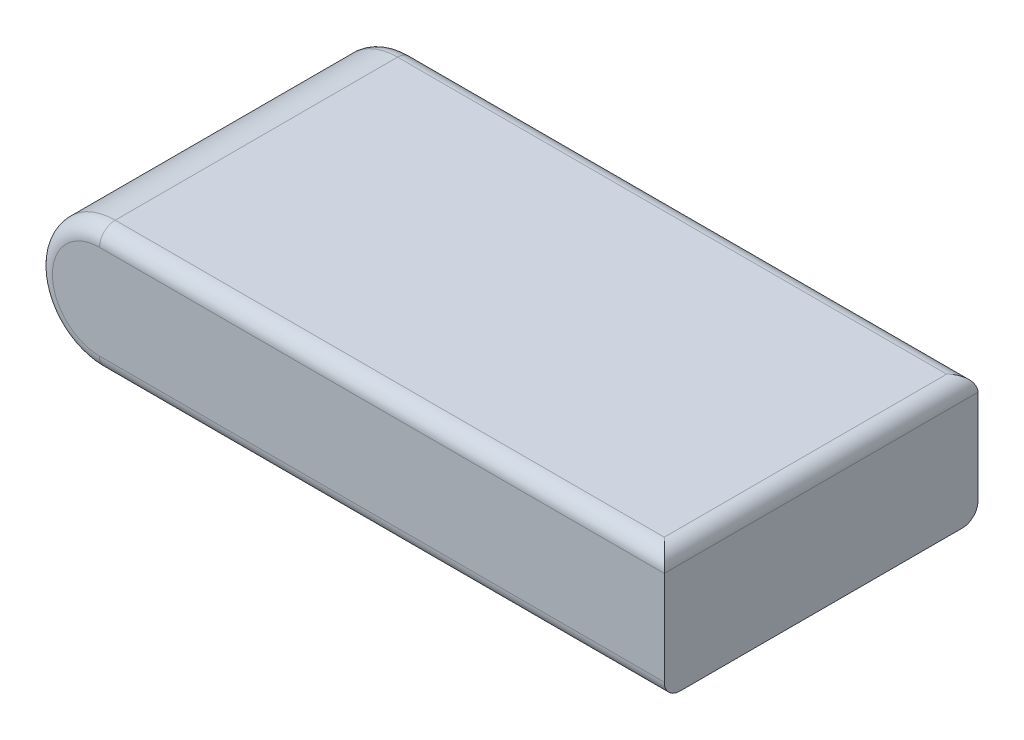
ISO-10303-21;
HEADER;
FILE_DESCRIPTION(('STEP AP214'),'2;1');
FILE_NAME('part.step','',(''),(''),'','','');
FILE_SCHEMA(('AUTOMOTIVE_DESIGN { 1 0 10303 214 1 1 1 1 }'));
ENDSEC;
DATA;
#1=APPLICATION_CONTEXT('core data for automotive mechanical design processes');
#2=APPLICATION_PROTOCOL_DEFINITION('international standard','automotive_design',2000,#1);
#3=PRODUCT_CONTEXT('',#1,'mechanical');
#4=PRODUCT('Part','Part','',(#3));
#5=PRODUCT_RELATED_PRODUCT_CATEGORY('part','',(#4));
#6=PRODUCT_DEFINITION_FORMATION('','',#4);
#7=PRODUCT_DEFINITION_CONTEXT('part definition',#1,'design');
#8=PRODUCT_DEFINITION('design','',#6,#7);
#9=PRODUCT_DEFINITION_SHAPE('','',#8);
#10=(LENGTH_UNIT() NAMED_UNIT(*) SI_UNIT(.MILLI.,.METRE.));
#11=(NAMED_UNIT(*) PLANE_ANGLE_UNIT() SI_UNIT($,.RADIAN.));
#12=(NAMED_UNIT(*) SI_UNIT($,.STERADIAN.) SOLID_ANGLE_UNIT());
#13=UNCERTAINTY_MEASURE_WITH_UNIT(LENGTH_MEASURE(1.E-05),#10,'distance_accuracy_value','');
#14=(GEOMETRIC_REPRESENTATION_CONTEXT(3) GLOBAL_UNCERTAINTY_ASSIGNED_CONTEXT((#13)) GLOBAL_UNIT_ASSIGNED_CONTEXT((#10,
#11,#12)) REPRESENTATION_CONTEXT('',''));
#15=CARTESIAN_POINT('',(0.,0.,0.));
#16=DIRECTION('',(0.,0.,1.));
#17=DIRECTION('',(1.,0.,0.));
#18=AXIS2_PLACEMENT_3D('',#15,#16,#17);
#19=CARTESIAN_POINT('',(-18.,0.,20.));
#20=DIRECTION('',(0.,0.,-1.));
#21=DIRECTION('',(-1.,0.,0.));
#22=AXIS2_PLACEMENT_3D('',#19,#20,#21);
#23=CYLINDRICAL_SURFACE('',#22,4.);
#24=DIRECTION('',(0.,0.,-1.));
#25=VECTOR('',#24,1.);
#26=CARTESIAN_POINT('',(-18.,-4.00000000000001,20.));
#27=LINE('',#26,#25);
#28=CARTESIAN_POINT('',(-18.,-4.00000000000001,19.));
#29=VERTEX_POINT('',#28);
#30=CARTESIAN_POINT('',(-18.,-4.00000000000001,1.));
#31=VERTEX_POINT('',#30);
#32=EDGE_CURVE('E133',#29,#31,#27,.T.);
#33=ORIENTED_EDGE('',*,*,#32,.F.);
#34=CARTESIAN_POINT('',(-18.,0.,19.));
#35=DIRECTION('',(0.,0.,-1.));
#36=DIRECTION('',(-1.,0.,0.));
#37=AXIS2_PLACEMENT_3D('',#34,#35,#36);
#38=CIRCLE('',#37,4.);
#39=CARTESIAN_POINT('',(-18.,4.,19.));
#40=VERTEX_POINT('',#39);
#41=EDGE_CURVE('E145',#29,#40,#38,.T.);
#42=ORIENTED_EDGE('',*,*,#41,.T.);
#43=DIRECTION('',(0.,0.,-1.));
#44=VECTOR('',#43,1.);
#45=CARTESIAN_POINT('',(-18.,4.,20.));
#46=LINE('',#45,#44);
#47=CARTESIAN_POINT('',(-18.,4.,1.));
#48=VERTEX_POINT('',#47);
#49=EDGE_CURVE('E124',#40,#48,#46,.T.);
#50=ORIENTED_EDGE('',*,*,#49,.T.);
#51=CARTESIAN_POINT('',(-18.,0.,1.));
#52=DIRECTION('',(0.,0.,-1.));
#53=DIRECTION('',(-1.,0.,0.));
#54=AXIS2_PLACEMENT_3D('',#51,#52,#53);
#55=CIRCLE('',#54,4.);
#56=EDGE_CURVE('E143',#48,#31,#55,.F.);
#57=ORIENTED_EDGE('',*,*,#56,.T.);
#58=EDGE_LOOP('',(#33,#42,#50,#57));
#59=FACE_BOUND('',#58,.T.);
#60=ADVANCED_FACE('F35',(#59),#23,.T.);
#61=CARTESIAN_POINT('',(18.,-4.,20.));
#62=DIRECTION('',(0.,1.,0.));
#63=DIRECTION('',(-1.,0.,0.));
#64=AXIS2_PLACEMENT_3D('',#61,#62,#63);
#65=PLANE('',#64);
#66=DIRECTION('',(0.,0.,-1.));
#67=VECTOR('',#66,1.);
#68=CARTESIAN_POINT('',(18.,-4.,20.));
#69=LINE('',#68,#67);
#70=CARTESIAN_POINT('',(18.,-4.,19.));
#71=VERTEX_POINT('',#70);
#72=CARTESIAN_POINT('',(18.,-4.,1.));
#73=VERTEX_POINT('',#72);
#74=EDGE_CURVE('E128',#71,#73,#69,.T.);
#75=ORIENTED_EDGE('',*,*,#74,.F.);
#76=DIRECTION('',(1.,0.,0.));
#77=VECTOR('',#76,1.);
#78=CARTESIAN_POINT('',(18.,-4.,19.));
#79=LINE('',#78,#77);
#80=EDGE_CURVE('E103',#71,#29,#79,.F.);
#81=ORIENTED_EDGE('',*,*,#80,.T.);
#82=ORIENTED_EDGE('',*,*,#32,.T.);
#83=DIRECTION('',(1.,0.,0.));
#84=VECTOR('',#83,1.);
#85=CARTESIAN_POINT('',(18.,-4.,1.));
#86=LINE('',#85,#84);
#87=EDGE_CURVE('E108',#31,#73,#86,.T.);
#88=ORIENTED_EDGE('',*,*,#87,.T.);
#89=EDGE_LOOP('',(#75,#81,#82,#88));
#90=FACE_BOUND('',#89,.T.);
#91=ADVANCED_FACE('F182',(#90),#65,.F.);
#92=CARTESIAN_POINT('',(18.,-4.,20.));
#93=DIRECTION('',(-1.,0.,0.));
#94=DIRECTION('',(0.,0.,1.));
#95=AXIS2_PLACEMENT_3D('',#92,#93,#94);
#96=PLANE('',#95);
#97=DIRECTION('',(0.,1.,0.));
#98=VECTOR('',#97,1.);
#99=CARTESIAN_POINT('',(18.,-4.,20.));
#100=LINE('',#99,#98);
#101=CARTESIAN_POINT('',(18.,-3.,20.));
#102=VERTEX_POINT('',#101);
#103=CARTESIAN_POINT('',(18.,3.,20.));
#104=VERTEX_POINT('',#103);
#105=EDGE_CURVE('E114',#102,#104,#100,.T.);
#106=ORIENTED_EDGE('',*,*,#105,.F.);
#107=CARTESIAN_POINT('',(18.,-3.,19.));
#108=DIRECTION('',(-1.,0.,0.));
#109=DIRECTION('',(0.,0.,1.));
#110=AXIS2_PLACEMENT_3D('',#107,#108,#109);
#111=CIRCLE('',#110,1.);
#112=EDGE_CURVE('E98',#102,#71,#111,.F.);
#113=ORIENTED_EDGE('',*,*,#112,.T.);
#114=ORIENTED_EDGE('',*,*,#74,.T.);
#115=CARTESIAN_POINT('',(18.,-3.,1.));
#116=DIRECTION('',(-1.,0.,0.));
#117=DIRECTION('',(0.,0.,1.));
#118=AXIS2_PLACEMENT_3D('',#115,#116,#117);
#119=CIRCLE('',#118,1.);
#120=CARTESIAN_POINT('',(18.,-3.,0.));
#121=VERTEX_POINT('',#120);
#122=EDGE_CURVE('E109',#73,#121,#119,.F.);
#123=ORIENTED_EDGE('',*,*,#122,.T.);
#124=DIRECTION('',(0.,1.,0.));
#125=VECTOR('',#124,1.);
#126=CARTESIAN_POINT('',(18.,-4.,0.));
#127=LINE('',#126,#125);
#128=CARTESIAN_POINT('',(18.,3.,0.));
#129=VERTEX_POINT('',#128);
#130=EDGE_CURVE('E125',#121,#129,#127,.T.);
#131=ORIENTED_EDGE('',*,*,#130,.T.);
#132=DIRECTION('',(0.,0.,-1.));
#133=VECTOR('',#132,1.);
#134=CARTESIAN_POINT('',(18.,3.,20.));
#135=LINE('',#134,#133);
#136=EDGE_CURVE('E119',#129,#104,#135,.F.);
#137=ORIENTED_EDGE('',*,*,#136,.T.);
#138=EDGE_LOOP('',(#106,#113,#114,#123,#131,#137));
#139=FACE_BOUND('',#138,.T.);
#140=ADVANCED_FACE('F121',(#139),#96,.F.);
#141=CARTESIAN_POINT('',(18.,4.,20.));
#142=DIRECTION('',(0.,-1.,0.));
#143=DIRECTION('',(1.,0.,0.));
#144=AXIS2_PLACEMENT_3D('',#141,#142,#143);
#145=PLANE('',#144);
#146=ORIENTED_EDGE('',*,*,#49,.F.);
#147=DIRECTION('',(-1.,0.,0.));
#148=VECTOR('',#147,1.);
#149=CARTESIAN_POINT('',(18.,4.,19.));
#150=LINE('',#149,#148);
#151=CARTESIAN_POINT('',(17.,4.,19.));
#152=VERTEX_POINT('',#151);
#153=EDGE_CURVE('E11',#40,#152,#150,.F.);
#154=ORIENTED_EDGE('',*,*,#153,.T.);
#155=DIRECTION('',(0.,0.,-1.));
#156=VECTOR('',#155,1.);
#157=CARTESIAN_POINT('',(17.,4.,20.));
#158=LINE('',#157,#156);
#159=CARTESIAN_POINT('',(17.,4.,1.));
#160=VERTEX_POINT('',#159);
#161=EDGE_CURVE('E44',#152,#160,#158,.T.);
#162=ORIENTED_EDGE('',*,*,#161,.T.);
#163=DIRECTION('',(-1.,0.,0.));
#164=VECTOR('',#163,1.);
#165=CARTESIAN_POINT('',(-18.,4.,1.));
#166=LINE('',#165,#164);
#167=EDGE_CURVE('E153',#160,#48,#166,.T.);
#168=ORIENTED_EDGE('',*,*,#167,.T.);
#169=EDGE_LOOP('',(#146,#154,#162,#168));
#170=FACE_BOUND('',#169,.T.);
#171=ADVANCED_FACE('F199',(#170),#145,.F.);
#172=CARTESIAN_POINT('',(-18.,0.,20.));
#173=DIRECTION('',(0.,0.,-1.));
#174=DIRECTION('',(-1.,0.,0.));
#175=AXIS2_PLACEMENT_3D('',#172,#173,#174);
#176=PLANE('',#175);
#177=CARTESIAN_POINT('',(-18.,0.,20.));
#178=DIRECTION('',(0.,0.,-1.));
#179=DIRECTION('',(-1.,0.,0.));
#180=AXIS2_PLACEMENT_3D('',#177,#178,#179);
#181=CIRCLE('',#180,3.);
#182=CARTESIAN_POINT('',(-18.,3.,20.));
#183=VERTEX_POINT('',#182);
#184=CARTESIAN_POINT('',(-18.,-3.00000000000001,20.));
#185=VERTEX_POINT('',#184);
#186=EDGE_CURVE('E117',#183,#185,#181,.F.);
#187=ORIENTED_EDGE('',*,*,#186,.T.);
#188=DIRECTION('',(1.,0.,0.));
#189=VECTOR('',#188,1.);
#190=CARTESIAN_POINT('',(-18.,-3.00000000000001,20.));
#191=LINE('',#190,#189);
#192=EDGE_CURVE('E102',#185,#102,#191,.T.);
#193=ORIENTED_EDGE('',*,*,#192,.T.);
#194=ORIENTED_EDGE('',*,*,#105,.T.);
#195=DIRECTION('',(-1.,0.,0.));
#196=VECTOR('',#195,1.);
#197=CARTESIAN_POINT('',(-18.,3.,20.));
#198=LINE('',#197,#196);
#199=EDGE_CURVE('E136',#104,#183,#198,.T.);
#200=ORIENTED_EDGE('',*,*,#199,.T.);
#201=EDGE_LOOP('',(#187,#193,#194,#200));
#202=FACE_BOUND('',#201,.T.);
#203=ADVANCED_FACE('F113',(#202),#176,.F.);
#204=CARTESIAN_POINT('',(-18.,0.,0.));
#205=DIRECTION('',(0.,0.,-1.));
#206=DIRECTION('',(-1.,0.,0.));
#207=AXIS2_PLACEMENT_3D('',#204,#205,#206);
#208=PLANE('',#207);
#209=ORIENTED_EDGE('',*,*,#130,.F.);
#210=DIRECTION('',(1.,0.,0.));
#211=VECTOR('',#210,1.);
#212=CARTESIAN_POINT('',(-18.,-3.00000000000001,0.));
#213=LINE('',#212,#211);
#214=CARTESIAN_POINT('',(-18.,-3.00000000000001,0.));
#215=VERTEX_POINT('',#214);
#216=EDGE_CURVE('E151',#121,#215,#213,.F.);
#217=ORIENTED_EDGE('',*,*,#216,.T.);
#218=CARTESIAN_POINT('',(-18.,0.,0.));
#219=DIRECTION('',(0.,0.,-1.));
#220=DIRECTION('',(-1.,0.,0.));
#221=AXIS2_PLACEMENT_3D('',#218,#219,#220);
#222=CIRCLE('',#221,3.);
#223=CARTESIAN_POINT('',(-18.,3.,0.));
#224=VERTEX_POINT('',#223);
#225=EDGE_CURVE('E149',#215,#224,#222,.T.);
#226=ORIENTED_EDGE('',*,*,#225,.T.);
#227=DIRECTION('',(-1.,0.,0.));
#228=VECTOR('',#227,1.);
#229=CARTESIAN_POINT('',(18.,3.,0.));
#230=LINE('',#229,#228);
#231=EDGE_CURVE('E147',#224,#129,#230,.F.);
#232=ORIENTED_EDGE('',*,*,#231,.T.);
#233=EDGE_LOOP('',(#209,#217,#226,#232));
#234=FACE_BOUND('',#233,.T.);
#235=ADVANCED_FACE('F187',(#234),#208,.T.);
#236=CARTESIAN_POINT('',(18.,-3.,1.));
#237=DIRECTION('',(-1.,0.,0.));
#238=DIRECTION('',(0.,-1.,0.));
#239=AXIS2_PLACEMENT_3D('',#236,#237,#238);
#240=CYLINDRICAL_SURFACE('',#239,1.);
#241=ORIENTED_EDGE('',*,*,#122,.F.);
#242=ORIENTED_EDGE('',*,*,#87,.F.);
#243=CARTESIAN_POINT('',(-18.,-3.00000000000001,1.));
#244=DIRECTION('',(-1.,0.,0.));
#245=DIRECTION('',(0.,0.,1.));
#246=AXIS2_PLACEMENT_3D('',#243,#244,#245);
#247=CIRCLE('',#246,1.);
#248=EDGE_CURVE('E39',#215,#31,#247,.T.);
#249=ORIENTED_EDGE('',*,*,#248,.F.);
#250=ORIENTED_EDGE('',*,*,#216,.F.);
#251=EDGE_LOOP('',(#241,#242,#249,#250));
#252=FACE_BOUND('',#251,.T.);
#253=ADVANCED_FACE('F37',(#252),#240,.T.);
#254=CARTESIAN_POINT('',(-18.,0.,1.));
#255=DIRECTION('',(0.,0.,-1.));
#256=DIRECTION('',(-1.,0.,0.));
#257=AXIS2_PLACEMENT_3D('',#254,#255,#256);
#258=TOROIDAL_SURFACE('',#257,3.,1.);
#259=ORIENTED_EDGE('',*,*,#248,.T.);
#260=ORIENTED_EDGE('',*,*,#56,.F.);
#261=CARTESIAN_POINT('',(-18.,3.,1.));
#262=DIRECTION('',(1.,0.,0.));
#263=DIRECTION('',(0.,0.,-1.));
#264=AXIS2_PLACEMENT_3D('',#261,#262,#263);
#265=CIRCLE('',#264,1.);
#266=EDGE_CURVE('E166',#224,#48,#265,.T.);
#267=ORIENTED_EDGE('',*,*,#266,.F.);
#268=ORIENTED_EDGE('',*,*,#225,.F.);
#269=EDGE_LOOP('',(#259,#260,#267,#268));
#270=FACE_BOUND('',#269,.T.);
#271=ADVANCED_FACE('F176',(#270),#258,.T.);
#272=CARTESIAN_POINT('',(18.,3.,1.));
#273=DIRECTION('',(1.,0.,0.));
#274=DIRECTION('',(0.,1.,0.));
#275=AXIS2_PLACEMENT_3D('',#272,#273,#274);
#276=CYLINDRICAL_SURFACE('',#275,1.);
#277=ORIENTED_EDGE('',*,*,#266,.T.);
#278=ORIENTED_EDGE('',*,*,#167,.F.);
#279=CARTESIAN_POINT('',(17.,3.,1.));
#280=DIRECTION('',(0.707106781186547,0.,0.707106781186547));
#281=DIRECTION('',(0.707106781186547,0.,-0.707106781186547));
#282=AXIS2_PLACEMENT_3D('',#279,#280,#281);
#283=ELLIPSE('',#282,1.41421356237309,1.);
#284=EDGE_CURVE('E164',#129,#160,#283,.T.);
#285=ORIENTED_EDGE('',*,*,#284,.F.);
#286=ORIENTED_EDGE('',*,*,#231,.F.);
#287=EDGE_LOOP('',(#277,#278,#285,#286));
#288=FACE_BOUND('',#287,.T.);
#289=ADVANCED_FACE('F188',(#288),#276,.T.);
#290=CARTESIAN_POINT('',(17.,3.,20.));
#291=DIRECTION('',(0.,0.,-1.));
#292=DIRECTION('',(-1.,0.,0.));
#293=AXIS2_PLACEMENT_3D('',#290,#291,#292);
#294=CYLINDRICAL_SURFACE('',#293,1.);
#295=ORIENTED_EDGE('',*,*,#284,.T.);
#296=ORIENTED_EDGE('',*,*,#161,.F.);
#297=CARTESIAN_POINT('',(17.,3.,19.));
#298=DIRECTION('',(-0.707106781186547,0.,0.707106781186547));
#299=DIRECTION('',(-0.707106781186547,0.,-0.707106781186547));
#300=AXIS2_PLACEMENT_3D('',#297,#298,#299);
#301=ELLIPSE('',#300,1.41421356237309,1.);
#302=EDGE_CURVE('E161',#104,#152,#301,.T.);
#303=ORIENTED_EDGE('',*,*,#302,.F.);
#304=ORIENTED_EDGE('',*,*,#136,.F.);
#305=EDGE_LOOP('',(#295,#296,#303,#304));
#306=FACE_BOUND('',#305,.T.);
#307=ADVANCED_FACE('F190',(#306),#294,.T.);
#308=CARTESIAN_POINT('',(-18.,3.,19.));
#309=DIRECTION('',(-1.,0.,0.));
#310=DIRECTION('',(0.,-1.,0.));
#311=AXIS2_PLACEMENT_3D('',#308,#309,#310);
#312=CYLINDRICAL_SURFACE('',#311,1.);
#313=ORIENTED_EDGE('',*,*,#302,.T.);
#314=ORIENTED_EDGE('',*,*,#153,.F.);
#315=CARTESIAN_POINT('',(-18.,3.,19.));
#316=DIRECTION('',(-1.,0.,0.));
#317=DIRECTION('',(0.,0.,1.));
#318=AXIS2_PLACEMENT_3D('',#315,#316,#317);
#319=CIRCLE('',#318,1.);
#320=EDGE_CURVE('E158',#183,#40,#319,.T.);
#321=ORIENTED_EDGE('',*,*,#320,.F.);
#322=ORIENTED_EDGE('',*,*,#199,.F.);
#323=EDGE_LOOP('',(#313,#314,#321,#322));
#324=FACE_BOUND('',#323,.T.);
#325=ADVANCED_FACE('F194',(#324),#312,.T.);
#326=CARTESIAN_POINT('',(-18.,0.,19.));
#327=DIRECTION('',(0.,0.,-1.));
#328=DIRECTION('',(-1.,0.,0.));
#329=AXIS2_PLACEMENT_3D('',#326,#327,#328);
#330=TOROIDAL_SURFACE('',#329,3.,1.);
#331=ORIENTED_EDGE('',*,*,#320,.T.);
#332=ORIENTED_EDGE('',*,*,#41,.F.);
#333=CARTESIAN_POINT('',(-18.,-3.00000000000001,19.));
#334=DIRECTION('',(1.,0.,0.));
#335=DIRECTION('',(0.,0.,-1.));
#336=AXIS2_PLACEMENT_3D('',#333,#334,#335);
#337=CIRCLE('',#336,1.);
#338=EDGE_CURVE('E156',#185,#29,#337,.T.);
#339=ORIENTED_EDGE('',*,*,#338,.F.);
#340=ORIENTED_EDGE('',*,*,#186,.F.);
#341=EDGE_LOOP('',(#331,#332,#339,#340));
#342=FACE_BOUND('',#341,.T.);
#343=ADVANCED_FACE('F197',(#342),#330,.T.);
#344=CARTESIAN_POINT('',(-18.,-3.00000000000001,19.));
#345=DIRECTION('',(1.,0.,0.));
#346=DIRECTION('',(0.,1.,0.));
#347=AXIS2_PLACEMENT_3D('',#344,#345,#346);
#348=CYLINDRICAL_SURFACE('',#347,1.);
#349=ORIENTED_EDGE('',*,*,#338,.T.);
#350=ORIENTED_EDGE('',*,*,#80,.F.);
#351=ORIENTED_EDGE('',*,*,#112,.F.);
#352=ORIENTED_EDGE('',*,*,#192,.F.);
#353=EDGE_LOOP('',(#349,#350,#351,#352));
#354=FACE_BOUND('',#353,.T.);
#355=ADVANCED_FACE('F101',(#354),#348,.T.);
#356=CLOSED_SHELL('',(#60,#91,#140,#171,#203,#235,#253,#271,#289,#307,#325,#343,#355));
#357=MANIFOLD_SOLID_BREP('B2',#356);
#358=ADVANCED_BREP_SHAPE_REPRESENTATION('',(#18,#357),#14);
#359=SHAPE_DEFINITION_REPRESENTATION(#9,#358);
ENDSEC;
END-ISO-10303-21;
